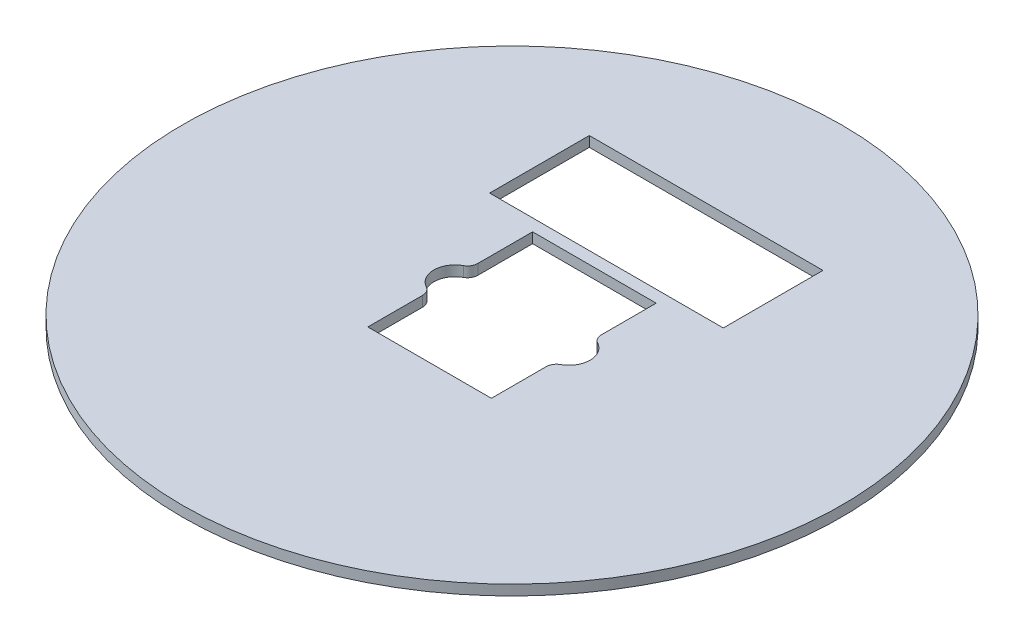
ISO-10303-21;
HEADER;
FILE_DESCRIPTION(('STEP AP214'),'2;1');
FILE_NAME('part.step','',(''),(''),'','','');
FILE_SCHEMA(('AUTOMOTIVE_DESIGN { 1 0 10303 214 1 1 1 1 }'));
ENDSEC;
DATA;
#1=APPLICATION_CONTEXT('core data for automotive mechanical design processes');
#2=APPLICATION_PROTOCOL_DEFINITION('international standard','automotive_design',2000,#1);
#3=PRODUCT_CONTEXT('',#1,'mechanical');
#4=PRODUCT('Part','Part','',(#3));
#5=PRODUCT_RELATED_PRODUCT_CATEGORY('part','',(#4));
#6=PRODUCT_DEFINITION_FORMATION('','',#4);
#7=PRODUCT_DEFINITION_CONTEXT('part definition',#1,'design');
#8=PRODUCT_DEFINITION('design','',#6,#7);
#9=PRODUCT_DEFINITION_SHAPE('','',#8);
#10=(LENGTH_UNIT() NAMED_UNIT(*) SI_UNIT(.MILLI.,.METRE.));
#11=(NAMED_UNIT(*) PLANE_ANGLE_UNIT() SI_UNIT($,.RADIAN.));
#12=(NAMED_UNIT(*) SI_UNIT($,.STERADIAN.) SOLID_ANGLE_UNIT());
#13=UNCERTAINTY_MEASURE_WITH_UNIT(LENGTH_MEASURE(1.E-05),#10,'distance_accuracy_value','');
#14=(GEOMETRIC_REPRESENTATION_CONTEXT(3) GLOBAL_UNCERTAINTY_ASSIGNED_CONTEXT((#13)) GLOBAL_UNIT_ASSIGNED_CONTEXT((#10,
#11,#12)) REPRESENTATION_CONTEXT('',''));
#15=CARTESIAN_POINT('',(0.,0.,0.));
#16=DIRECTION('',(0.,0.,1.));
#17=DIRECTION('',(1.,0.,0.));
#18=AXIS2_PLACEMENT_3D('',#15,#16,#17);
#19=CARTESIAN_POINT('',(0.,6.35,0.));
#20=DIRECTION('',(0.,1.,0.));
#21=DIRECTION('',(0.,0.,1.));
#22=AXIS2_PLACEMENT_3D('',#19,#20,#21);
#23=PLANE('',#22);
#24=DIRECTION('',(0.,0.,-1.));
#25=VECTOR('',#24,1.);
#26=CARTESIAN_POINT('',(72.029944132483,6.35,-58.2447033909338));
#27=LINE('',#26,#25);
#28=CARTESIAN_POINT('',(72.029944132483,6.35,-58.2447033909338));
#29=VERTEX_POINT('',#28);
#30=CARTESIAN_POINT('',(72.029944132483,6.35,-119.711965927598));
#31=VERTEX_POINT('',#30);
#32=EDGE_CURVE('E160',#29,#31,#27,.T.);
#33=ORIENTED_EDGE('',*,*,#32,.F.);
#34=DIRECTION('',(1.,0.,0.));
#35=VECTOR('',#34,1.);
#36=CARTESIAN_POINT('',(-72.029944132483,6.35,-58.2447033909338));
#37=LINE('',#36,#35);
#38=CARTESIAN_POINT('',(-72.029944132483,6.35,-58.2447033909338));
#39=VERTEX_POINT('',#38);
#40=EDGE_CURVE('E181',#39,#29,#37,.T.);
#41=ORIENTED_EDGE('',*,*,#40,.F.);
#42=DIRECTION('',(0.,0.,1.));
#43=VECTOR('',#42,1.);
#44=CARTESIAN_POINT('',(-72.029944132483,6.35,-58.2447033909338));
#45=LINE('',#44,#43);
#46=CARTESIAN_POINT('',(-72.029944132483,6.35,-119.711965927598));
#47=VERTEX_POINT('',#46);
#48=EDGE_CURVE('E185',#47,#39,#45,.T.);
#49=ORIENTED_EDGE('',*,*,#48,.F.);
#50=DIRECTION('',(-1.,0.,0.));
#51=VECTOR('',#50,1.);
#52=CARTESIAN_POINT('',(-72.029944132483,6.35,-119.711965927598));
#53=LINE('',#52,#51);
#54=EDGE_CURVE('E197',#31,#47,#53,.T.);
#55=ORIENTED_EDGE('',*,*,#54,.F.);
#56=EDGE_LOOP('',(#33,#41,#49,#55));
#57=FACE_BOUND('',#56,.T.);
#58=CARTESIAN_POINT('',(0.,6.35,0.));
#59=DIRECTION('',(0.,1.,0.));
#60=DIRECTION('',(0.,0.,1.));
#61=AXIS2_PLACEMENT_3D('',#58,#59,#60);
#62=CIRCLE('',#61,203.2);
#63=CARTESIAN_POINT('',(0.,6.35,203.2));
#64=VERTEX_POINT('',#63);
#65=EDGE_CURVE('E263',#64,#64,#62,.T.);
#66=ORIENTED_EDGE('',*,*,#65,.T.);
#67=EDGE_LOOP('',(#66));
#68=FACE_BOUND('',#67,.T.);
#69=DIRECTION('',(0.,0.,1.));
#70=VECTOR('',#69,1.);
#71=CARTESIAN_POINT('',(-38.1,6.35,0.));
#72=LINE('',#71,#70);
#73=CARTESIAN_POINT('',(-38.1,6.35,17.009335660401));
#74=VERTEX_POINT('',#73);
#75=CARTESIAN_POINT('',(-38.1,6.35,50.8));
#76=VERTEX_POINT('',#75);
#77=EDGE_CURVE('E235',#74,#76,#72,.T.);
#78=ORIENTED_EDGE('',*,*,#77,.F.);
#79=CARTESIAN_POINT('',(-44.45,6.35,17.009335660401));
#80=DIRECTION('',(0.,1.,0.));
#81=DIRECTION('',(0.,0.,1.));
#82=AXIS2_PLACEMENT_3D('',#79,#80,#81);
#83=CIRCLE('',#82,6.35);
#84=CARTESIAN_POINT('',(-41.401340380558,6.35,11.4390417251778));
#85=VERTEX_POINT('',#84);
#86=EDGE_CURVE('E62',#74,#85,#83,.T.);
#87=ORIENTED_EDGE('',*,*,#86,.T.);
#88=CARTESIAN_POINT('',(-35.1406753244214,6.35,0.));
#89=DIRECTION('',(0.,1.,0.));
#90=DIRECTION('',(0.,0.,1.));
#91=AXIS2_PLACEMENT_3D('',#88,#89,#90);
#92=CIRCLE('',#91,13.0402301565382);
#93=CARTESIAN_POINT('',(-41.401340380558,6.35,-11.4390417251778));
#94=VERTEX_POINT('',#93);
#95=EDGE_CURVE('E188',#94,#85,#92,.T.);
#96=ORIENTED_EDGE('',*,*,#95,.F.);
#97=CARTESIAN_POINT('',(-44.45,6.35,-17.0093356604009));
#98=DIRECTION('',(0.,1.,0.));
#99=DIRECTION('',(0.,0.,1.));
#100=AXIS2_PLACEMENT_3D('',#97,#98,#99);
#101=CIRCLE('',#100,6.35);
#102=CARTESIAN_POINT('',(-38.1,6.35,-17.0093356604009));
#103=VERTEX_POINT('',#102);
#104=EDGE_CURVE('E301',#94,#103,#101,.T.);
#105=ORIENTED_EDGE('',*,*,#104,.T.);
#106=CARTESIAN_POINT('',(-38.1,6.35,-50.8));
#107=VERTEX_POINT('',#106);
#108=EDGE_CURVE('E236',#107,#103,#72,.T.);
#109=ORIENTED_EDGE('',*,*,#108,.F.);
#110=DIRECTION('',(-1.,0.,0.));
#111=VECTOR('',#110,1.);
#112=CARTESIAN_POINT('',(0.,6.35,-50.8));
#113=LINE('',#112,#111);
#114=CARTESIAN_POINT('',(38.1,6.35,-50.8));
#115=VERTEX_POINT('',#114);
#116=EDGE_CURVE('E207',#115,#107,#113,.T.);
#117=ORIENTED_EDGE('',*,*,#116,.F.);
#118=DIRECTION('',(0.,0.,1.));
#119=VECTOR('',#118,1.);
#120=CARTESIAN_POINT('',(38.1,6.35,0.));
#121=LINE('',#120,#119);
#122=CARTESIAN_POINT('',(38.1,6.35,-17.009335660401));
#123=VERTEX_POINT('',#122);
#124=EDGE_CURVE('E218',#115,#123,#121,.T.);
#125=ORIENTED_EDGE('',*,*,#124,.T.);
#126=CARTESIAN_POINT('',(44.45,6.35,-17.009335660401));
#127=DIRECTION('',(0.,1.,0.));
#128=DIRECTION('',(0.,0.,1.));
#129=AXIS2_PLACEMENT_3D('',#126,#127,#128);
#130=CIRCLE('',#129,6.35);
#131=CARTESIAN_POINT('',(41.401340380558,6.35,-11.4390417251778));
#132=VERTEX_POINT('',#131);
#133=EDGE_CURVE('E288',#123,#132,#130,.T.);
#134=ORIENTED_EDGE('',*,*,#133,.T.);
#135=CARTESIAN_POINT('',(35.1406753244215,6.35,0.));
#136=DIRECTION('',(0.,1.,0.));
#137=DIRECTION('',(0.,0.,1.));
#138=AXIS2_PLACEMENT_3D('',#135,#136,#137);
#139=CIRCLE('',#138,13.0402301565382);
#140=CARTESIAN_POINT('',(41.401340380558,6.35,11.4390417251778));
#141=VERTEX_POINT('',#140);
#142=EDGE_CURVE('E393',#132,#141,#139,.F.);
#143=ORIENTED_EDGE('',*,*,#142,.T.);
#144=CARTESIAN_POINT('',(44.45,6.35,17.009335660401));
#145=DIRECTION('',(0.,1.,0.));
#146=DIRECTION('',(0.,0.,1.));
#147=AXIS2_PLACEMENT_3D('',#144,#145,#146);
#148=CIRCLE('',#147,6.35);
#149=CARTESIAN_POINT('',(38.1,6.35,17.009335660401));
#150=VERTEX_POINT('',#149);
#151=EDGE_CURVE('E274',#141,#150,#148,.T.);
#152=ORIENTED_EDGE('',*,*,#151,.T.);
#153=CARTESIAN_POINT('',(38.1,6.35,50.8));
#154=VERTEX_POINT('',#153);
#155=EDGE_CURVE('E244',#150,#154,#121,.T.);
#156=ORIENTED_EDGE('',*,*,#155,.T.);
#157=DIRECTION('',(-1.,0.,0.));
#158=VECTOR('',#157,1.);
#159=CARTESIAN_POINT('',(0.,6.35,50.8));
#160=LINE('',#159,#158);
#161=EDGE_CURVE('E240',#154,#76,#160,.T.);
#162=ORIENTED_EDGE('',*,*,#161,.T.);
#163=EDGE_LOOP('',(#78,#87,#96,#105,#109,#117,#125,#134,#143,#152,#156,#162));
#164=FACE_BOUND('',#163,.T.);
#165=ADVANCED_FACE('F39',(#57,#68,#164),#23,.T.);
#166=CARTESIAN_POINT('',(0.,0.,0.));
#167=DIRECTION('',(0.,1.,0.));
#168=DIRECTION('',(0.,0.,1.));
#169=AXIS2_PLACEMENT_3D('',#166,#167,#168);
#170=PLANE('',#169);
#171=CARTESIAN_POINT('',(0.,0.,0.));
#172=DIRECTION('',(0.,1.,0.));
#173=DIRECTION('',(0.,0.,1.));
#174=AXIS2_PLACEMENT_3D('',#171,#172,#173);
#175=CIRCLE('',#174,203.2);
#176=CARTESIAN_POINT('',(0.,0.,203.2));
#177=VERTEX_POINT('',#176);
#178=EDGE_CURVE('E251',#177,#177,#175,.T.);
#179=ORIENTED_EDGE('',*,*,#178,.F.);
#180=EDGE_LOOP('',(#179));
#181=FACE_BOUND('',#180,.T.);
#182=DIRECTION('',(1.,0.,0.));
#183=VECTOR('',#182,1.);
#184=CARTESIAN_POINT('',(-72.029944132483,0.,-58.2447033909338));
#185=LINE('',#184,#183);
#186=CARTESIAN_POINT('',(-72.029944132483,0.,-58.2447033909338));
#187=VERTEX_POINT('',#186);
#188=CARTESIAN_POINT('',(72.029944132483,0.,-58.2447033909338));
#189=VERTEX_POINT('',#188);
#190=EDGE_CURVE('E166',#187,#189,#185,.T.);
#191=ORIENTED_EDGE('',*,*,#190,.T.);
#192=DIRECTION('',(0.,0.,-1.));
#193=VECTOR('',#192,1.);
#194=CARTESIAN_POINT('',(72.029944132483,0.,-58.2447033909338));
#195=LINE('',#194,#193);
#196=CARTESIAN_POINT('',(72.029944132483,0.,-119.711965927598));
#197=VERTEX_POINT('',#196);
#198=EDGE_CURVE('E157',#189,#197,#195,.T.);
#199=ORIENTED_EDGE('',*,*,#198,.T.);
#200=DIRECTION('',(-1.,0.,0.));
#201=VECTOR('',#200,1.);
#202=CARTESIAN_POINT('',(-72.029944132483,0.,-119.711965927598));
#203=LINE('',#202,#201);
#204=CARTESIAN_POINT('',(-72.029944132483,0.,-119.711965927598));
#205=VERTEX_POINT('',#204);
#206=EDGE_CURVE('E170',#197,#205,#203,.T.);
#207=ORIENTED_EDGE('',*,*,#206,.T.);
#208=DIRECTION('',(0.,0.,1.));
#209=VECTOR('',#208,1.);
#210=CARTESIAN_POINT('',(-72.029944132483,0.,-58.2447033909338));
#211=LINE('',#210,#209);
#212=EDGE_CURVE('E175',#205,#187,#211,.T.);
#213=ORIENTED_EDGE('',*,*,#212,.T.);
#214=EDGE_LOOP('',(#191,#199,#207,#213));
#215=FACE_BOUND('',#214,.T.);
#216=CARTESIAN_POINT('',(-35.1406753244214,0.,0.));
#217=DIRECTION('',(0.,1.,0.));
#218=DIRECTION('',(0.,0.,1.));
#219=AXIS2_PLACEMENT_3D('',#216,#217,#218);
#220=CIRCLE('',#219,13.0402301565382);
#221=CARTESIAN_POINT('',(-41.401340380558,0.,-11.4390417251778));
#222=VERTEX_POINT('',#221);
#223=CARTESIAN_POINT('',(-41.401340380558,0.,11.4390417251778));
#224=VERTEX_POINT('',#223);
#225=EDGE_CURVE('E389',#222,#224,#220,.T.);
#226=ORIENTED_EDGE('',*,*,#225,.T.);
#227=CARTESIAN_POINT('',(-44.45,0.,17.009335660401));
#228=DIRECTION('',(0.,1.,0.));
#229=DIRECTION('',(0.,0.,1.));
#230=AXIS2_PLACEMENT_3D('',#227,#228,#229);
#231=CIRCLE('',#230,6.35);
#232=CARTESIAN_POINT('',(-38.1,0.,17.009335660401));
#233=VERTEX_POINT('',#232);
#234=EDGE_CURVE('E11',#224,#233,#231,.F.);
#235=ORIENTED_EDGE('',*,*,#234,.T.);
#236=DIRECTION('',(0.,0.,1.));
#237=VECTOR('',#236,1.);
#238=CARTESIAN_POINT('',(-38.1,0.,0.));
#239=LINE('',#238,#237);
#240=CARTESIAN_POINT('',(-38.1,0.,50.8));
#241=VERTEX_POINT('',#240);
#242=EDGE_CURVE('E217',#233,#241,#239,.T.);
#243=ORIENTED_EDGE('',*,*,#242,.T.);
#244=DIRECTION('',(-1.,0.,0.));
#245=VECTOR('',#244,1.);
#246=CARTESIAN_POINT('',(0.,0.,50.8));
#247=LINE('',#246,#245);
#248=CARTESIAN_POINT('',(38.1,0.,50.8));
#249=VERTEX_POINT('',#248);
#250=EDGE_CURVE('E223',#249,#241,#247,.T.);
#251=ORIENTED_EDGE('',*,*,#250,.F.);
#252=DIRECTION('',(0.,0.,1.));
#253=VECTOR('',#252,1.);
#254=CARTESIAN_POINT('',(38.1,0.,0.));
#255=LINE('',#254,#253);
#256=CARTESIAN_POINT('',(38.1,0.,17.009335660401));
#257=VERTEX_POINT('',#256);
#258=EDGE_CURVE('E227',#257,#249,#255,.T.);
#259=ORIENTED_EDGE('',*,*,#258,.F.);
#260=CARTESIAN_POINT('',(44.45,0.,17.009335660401));
#261=DIRECTION('',(0.,1.,0.));
#262=DIRECTION('',(0.,0.,1.));
#263=AXIS2_PLACEMENT_3D('',#260,#261,#262);
#264=CIRCLE('',#263,6.35);
#265=CARTESIAN_POINT('',(41.401340380558,0.,11.4390417251778));
#266=VERTEX_POINT('',#265);
#267=EDGE_CURVE('E280',#257,#266,#264,.F.);
#268=ORIENTED_EDGE('',*,*,#267,.T.);
#269=CARTESIAN_POINT('',(35.1406753244215,0.,0.));
#270=DIRECTION('',(0.,1.,0.));
#271=DIRECTION('',(0.,0.,1.));
#272=AXIS2_PLACEMENT_3D('',#269,#270,#271);
#273=CIRCLE('',#272,13.0402301565382);
#274=CARTESIAN_POINT('',(41.401340380558,0.,-11.4390417251778));
#275=VERTEX_POINT('',#274);
#276=EDGE_CURVE('E198',#275,#266,#273,.F.);
#277=ORIENTED_EDGE('',*,*,#276,.F.);
#278=CARTESIAN_POINT('',(44.45,0.,-17.009335660401));
#279=DIRECTION('',(0.,1.,0.));
#280=DIRECTION('',(0.,0.,1.));
#281=AXIS2_PLACEMENT_3D('',#278,#279,#280);
#282=CIRCLE('',#281,6.35);
#283=CARTESIAN_POINT('',(38.1,0.,-17.009335660401));
#284=VERTEX_POINT('',#283);
#285=EDGE_CURVE('E294',#275,#284,#282,.F.);
#286=ORIENTED_EDGE('',*,*,#285,.T.);
#287=CARTESIAN_POINT('',(38.1,0.,-50.8));
#288=VERTEX_POINT('',#287);
#289=EDGE_CURVE('E228',#288,#284,#255,.T.);
#290=ORIENTED_EDGE('',*,*,#289,.F.);
#291=DIRECTION('',(-1.,0.,0.));
#292=VECTOR('',#291,1.);
#293=CARTESIAN_POINT('',(0.,0.,-50.8));
#294=LINE('',#293,#292);
#295=CARTESIAN_POINT('',(-38.1,0.,-50.8));
#296=VERTEX_POINT('',#295);
#297=EDGE_CURVE('E213',#288,#296,#294,.T.);
#298=ORIENTED_EDGE('',*,*,#297,.T.);
#299=CARTESIAN_POINT('',(-38.1,0.,-17.0093356604009));
#300=VERTEX_POINT('',#299);
#301=EDGE_CURVE('E219',#296,#300,#239,.T.);
#302=ORIENTED_EDGE('',*,*,#301,.T.);
#303=CARTESIAN_POINT('',(-44.45,0.,-17.0093356604009));
#304=DIRECTION('',(0.,1.,0.));
#305=DIRECTION('',(0.,0.,1.));
#306=AXIS2_PLACEMENT_3D('',#303,#304,#305);
#307=CIRCLE('',#306,6.35);
#308=EDGE_CURVE('E307',#300,#222,#307,.F.);
#309=ORIENTED_EDGE('',*,*,#308,.T.);
#310=EDGE_LOOP('',(#226,#235,#243,#251,#259,#268,#277,#286,#290,#298,#302,#309));
#311=FACE_BOUND('',#310,.T.);
#312=ADVANCED_FACE('F177',(#181,#215,#311),#170,.F.);
#313=CARTESIAN_POINT('',(38.1,0.,0.));
#314=DIRECTION('',(-1.,0.,0.));
#315=DIRECTION('',(0.,0.,1.));
#316=AXIS2_PLACEMENT_3D('',#313,#314,#315);
#317=PLANE('',#316);
#318=ORIENTED_EDGE('',*,*,#155,.F.);
#319=DIRECTION('',(0.,1.,0.));
#320=VECTOR('',#319,1.);
#321=CARTESIAN_POINT('',(38.1,0.,17.009335660401));
#322=LINE('',#321,#320);
#323=EDGE_CURVE('E277',#150,#257,#322,.F.);
#324=ORIENTED_EDGE('',*,*,#323,.T.);
#325=ORIENTED_EDGE('',*,*,#258,.T.);
#326=DIRECTION('',(0.,1.,0.));
#327=VECTOR('',#326,1.);
#328=CARTESIAN_POINT('',(38.1,0.,50.8));
#329=LINE('',#328,#327);
#330=EDGE_CURVE('E252',#249,#154,#329,.T.);
#331=ORIENTED_EDGE('',*,*,#330,.T.);
#332=EDGE_LOOP('',(#318,#324,#325,#331));
#333=FACE_BOUND('',#332,.T.);
#334=ADVANCED_FACE('F334',(#333),#317,.T.);
#335=ORIENTED_EDGE('',*,*,#289,.T.);
#336=DIRECTION('',(0.,1.,0.));
#337=VECTOR('',#336,1.);
#338=CARTESIAN_POINT('',(38.1,0.,-17.009335660401));
#339=LINE('',#338,#337);
#340=EDGE_CURVE('E284',#284,#123,#339,.T.);
#341=ORIENTED_EDGE('',*,*,#340,.T.);
#342=ORIENTED_EDGE('',*,*,#124,.F.);
#343=DIRECTION('',(0.,1.,0.));
#344=VECTOR('',#343,1.);
#345=CARTESIAN_POINT('',(38.1,0.,-50.8));
#346=LINE('',#345,#344);
#347=EDGE_CURVE('E248',#288,#115,#346,.T.);
#348=ORIENTED_EDGE('',*,*,#347,.F.);
#349=EDGE_LOOP('',(#335,#341,#342,#348));
#350=FACE_BOUND('',#349,.T.);
#351=ADVANCED_FACE('F378',(#350),#317,.T.);
#352=CARTESIAN_POINT('',(-38.1,0.,0.));
#353=DIRECTION('',(-1.,0.,0.));
#354=DIRECTION('',(0.,0.,1.));
#355=AXIS2_PLACEMENT_3D('',#352,#353,#354);
#356=PLANE('',#355);
#357=ORIENTED_EDGE('',*,*,#242,.F.);
#358=DIRECTION('',(0.,1.,0.));
#359=VECTOR('',#358,1.);
#360=CARTESIAN_POINT('',(-38.1,0.,17.009335660401));
#361=LINE('',#360,#359);
#362=EDGE_CURVE('E310',#233,#74,#361,.T.);
#363=ORIENTED_EDGE('',*,*,#362,.T.);
#364=ORIENTED_EDGE('',*,*,#77,.T.);
#365=DIRECTION('',(0.,1.,0.));
#366=VECTOR('',#365,1.);
#367=CARTESIAN_POINT('',(-38.1,0.,50.8));
#368=LINE('',#367,#366);
#369=EDGE_CURVE('E256',#241,#76,#368,.T.);
#370=ORIENTED_EDGE('',*,*,#369,.F.);
#371=EDGE_LOOP('',(#357,#363,#364,#370));
#372=FACE_BOUND('',#371,.T.);
#373=ADVANCED_FACE('F323',(#372),#356,.F.);
#374=CARTESIAN_POINT('',(0.,6.35,0.));
#375=DIRECTION('',(0.,-1.,0.));
#376=DIRECTION('',(0.,0.,-1.));
#377=AXIS2_PLACEMENT_3D('',#374,#375,#376);
#378=CYLINDRICAL_SURFACE('',#377,203.2);
#379=ORIENTED_EDGE('',*,*,#65,.F.);
#380=EDGE_LOOP('',(#379));
#381=FACE_BOUND('',#380,.T.);
#382=ORIENTED_EDGE('',*,*,#178,.T.);
#383=EDGE_LOOP('',(#382));
#384=FACE_BOUND('',#383,.T.);
#385=ADVANCED_FACE('F359',(#381,#384),#378,.T.);
#386=CARTESIAN_POINT('',(0.,0.,-50.8));
#387=DIRECTION('',(0.,0.,-1.));
#388=DIRECTION('',(-1.,0.,0.));
#389=AXIS2_PLACEMENT_3D('',#386,#387,#388);
#390=PLANE('',#389);
#391=ORIENTED_EDGE('',*,*,#116,.T.);
#392=DIRECTION('',(0.,1.,0.));
#393=VECTOR('',#392,1.);
#394=CARTESIAN_POINT('',(-38.1,0.,-50.8));
#395=LINE('',#394,#393);
#396=EDGE_CURVE('E232',#296,#107,#395,.T.);
#397=ORIENTED_EDGE('',*,*,#396,.F.);
#398=ORIENTED_EDGE('',*,*,#297,.F.);
#399=ORIENTED_EDGE('',*,*,#347,.T.);
#400=EDGE_LOOP('',(#391,#397,#398,#399));
#401=FACE_BOUND('',#400,.T.);
#402=ADVANCED_FACE('F356',(#401),#390,.F.);
#403=CARTESIAN_POINT('',(0.,0.,50.8));
#404=DIRECTION('',(0.,0.,-1.));
#405=DIRECTION('',(-1.,0.,0.));
#406=AXIS2_PLACEMENT_3D('',#403,#404,#405);
#407=PLANE('',#406);
#408=ORIENTED_EDGE('',*,*,#161,.F.);
#409=ORIENTED_EDGE('',*,*,#330,.F.);
#410=ORIENTED_EDGE('',*,*,#250,.T.);
#411=ORIENTED_EDGE('',*,*,#369,.T.);
#412=EDGE_LOOP('',(#408,#409,#410,#411));
#413=FACE_BOUND('',#412,.T.);
#414=ADVANCED_FACE('F327',(#413),#407,.T.);
#415=ORIENTED_EDGE('',*,*,#108,.T.);
#416=DIRECTION('',(0.,1.,0.));
#417=VECTOR('',#416,1.);
#418=CARTESIAN_POINT('',(-38.1,0.,-17.0093356604009));
#419=LINE('',#418,#417);
#420=EDGE_CURVE('E304',#103,#300,#419,.F.);
#421=ORIENTED_EDGE('',*,*,#420,.T.);
#422=ORIENTED_EDGE('',*,*,#301,.F.);
#423=ORIENTED_EDGE('',*,*,#396,.T.);
#424=EDGE_LOOP('',(#415,#421,#422,#423));
#425=FACE_BOUND('',#424,.T.);
#426=ADVANCED_FACE('F401',(#425),#356,.F.);
#427=CARTESIAN_POINT('',(72.029944132483,0.,-58.2447033909338));
#428=DIRECTION('',(1.,0.,0.));
#429=DIRECTION('',(0.,0.,-1.));
#430=AXIS2_PLACEMENT_3D('',#427,#428,#429);
#431=PLANE('',#430);
#432=ORIENTED_EDGE('',*,*,#32,.T.);
#433=DIRECTION('',(0.,1.,0.));
#434=VECTOR('',#433,1.);
#435=CARTESIAN_POINT('',(72.029944132483,0.,-119.711965927598));
#436=LINE('',#435,#434);
#437=EDGE_CURVE('E153',#197,#31,#436,.T.);
#438=ORIENTED_EDGE('',*,*,#437,.F.);
#439=ORIENTED_EDGE('',*,*,#198,.F.);
#440=DIRECTION('',(0.,1.,0.));
#441=VECTOR('',#440,1.);
#442=CARTESIAN_POINT('',(72.029944132483,0.,-58.2447033909338));
#443=LINE('',#442,#441);
#444=EDGE_CURVE('E204',#189,#29,#443,.T.);
#445=ORIENTED_EDGE('',*,*,#444,.T.);
#446=EDGE_LOOP('',(#432,#438,#439,#445));
#447=FACE_BOUND('',#446,.T.);
#448=ADVANCED_FACE('F155',(#447),#431,.F.);
#449=CARTESIAN_POINT('',(-72.029944132483,0.,-58.2447033909338));
#450=DIRECTION('',(0.,0.,1.));
#451=DIRECTION('',(1.,0.,0.));
#452=AXIS2_PLACEMENT_3D('',#449,#450,#451);
#453=PLANE('',#452);
#454=ORIENTED_EDGE('',*,*,#40,.T.);
#455=ORIENTED_EDGE('',*,*,#444,.F.);
#456=ORIENTED_EDGE('',*,*,#190,.F.);
#457=DIRECTION('',(0.,1.,0.));
#458=VECTOR('',#457,1.);
#459=CARTESIAN_POINT('',(-72.029944132483,0.,-58.2447033909338));
#460=LINE('',#459,#458);
#461=EDGE_CURVE('E208',#187,#39,#460,.T.);
#462=ORIENTED_EDGE('',*,*,#461,.T.);
#463=EDGE_LOOP('',(#454,#455,#456,#462));
#464=FACE_BOUND('',#463,.T.);
#465=ADVANCED_FACE('F407',(#464),#453,.F.);
#466=CARTESIAN_POINT('',(-72.029944132483,0.,-58.2447033909338));
#467=DIRECTION('',(-1.,0.,0.));
#468=DIRECTION('',(0.,0.,1.));
#469=AXIS2_PLACEMENT_3D('',#466,#467,#468);
#470=PLANE('',#469);
#471=ORIENTED_EDGE('',*,*,#48,.T.);
#472=ORIENTED_EDGE('',*,*,#461,.F.);
#473=ORIENTED_EDGE('',*,*,#212,.F.);
#474=DIRECTION('',(0.,1.,0.));
#475=VECTOR('',#474,1.);
#476=CARTESIAN_POINT('',(-72.029944132483,0.,-119.711965927598));
#477=LINE('',#476,#475);
#478=EDGE_CURVE('E165',#205,#47,#477,.T.);
#479=ORIENTED_EDGE('',*,*,#478,.T.);
#480=EDGE_LOOP('',(#471,#472,#473,#479));
#481=FACE_BOUND('',#480,.T.);
#482=ADVANCED_FACE('F421',(#481),#470,.F.);
#483=CARTESIAN_POINT('',(-72.029944132483,0.,-119.711965927598));
#484=DIRECTION('',(0.,0.,-1.));
#485=DIRECTION('',(-1.,0.,0.));
#486=AXIS2_PLACEMENT_3D('',#483,#484,#485);
#487=PLANE('',#486);
#488=ORIENTED_EDGE('',*,*,#54,.T.);
#489=ORIENTED_EDGE('',*,*,#478,.F.);
#490=ORIENTED_EDGE('',*,*,#206,.F.);
#491=ORIENTED_EDGE('',*,*,#437,.T.);
#492=EDGE_LOOP('',(#488,#489,#490,#491));
#493=FACE_BOUND('',#492,.T.);
#494=ADVANCED_FACE('F171',(#493),#487,.F.);
#495=CARTESIAN_POINT('',(-35.1406753244214,0.,0.));
#496=DIRECTION('',(0.,1.,0.));
#497=DIRECTION('',(0.,0.,1.));
#498=AXIS2_PLACEMENT_3D('',#495,#496,#497);
#499=CYLINDRICAL_SURFACE('',#498,13.0402301565382);
#500=ORIENTED_EDGE('',*,*,#95,.T.);
#501=DIRECTION('',(0.,1.,0.));
#502=VECTOR('',#501,1.);
#503=CARTESIAN_POINT('',(-41.401340380558,0.,11.4390417251778));
#504=LINE('',#503,#502);
#505=EDGE_CURVE('E48',#85,#224,#504,.F.);
#506=ORIENTED_EDGE('',*,*,#505,.T.);
#507=ORIENTED_EDGE('',*,*,#225,.F.);
#508=DIRECTION('',(0.,1.,0.));
#509=VECTOR('',#508,1.);
#510=CARTESIAN_POINT('',(-41.401340380558,0.,-11.4390417251778));
#511=LINE('',#510,#509);
#512=EDGE_CURVE('E297',#222,#94,#511,.T.);
#513=ORIENTED_EDGE('',*,*,#512,.T.);
#514=EDGE_LOOP('',(#500,#506,#507,#513));
#515=FACE_BOUND('',#514,.T.);
#516=ADVANCED_FACE('F388',(#515),#499,.F.);
#517=CARTESIAN_POINT('',(35.1406753244215,0.,0.));
#518=DIRECTION('',(0.,1.,0.));
#519=DIRECTION('',(0.,0.,1.));
#520=AXIS2_PLACEMENT_3D('',#517,#518,#519);
#521=CYLINDRICAL_SURFACE('',#520,13.0402301565382);
#522=ORIENTED_EDGE('',*,*,#142,.F.);
#523=DIRECTION('',(0.,1.,0.));
#524=VECTOR('',#523,1.);
#525=CARTESIAN_POINT('',(41.401340380558,0.,-11.4390417251778));
#526=LINE('',#525,#524);
#527=EDGE_CURVE('E291',#132,#275,#526,.F.);
#528=ORIENTED_EDGE('',*,*,#527,.T.);
#529=ORIENTED_EDGE('',*,*,#276,.T.);
#530=DIRECTION('',(0.,1.,0.));
#531=VECTOR('',#530,1.);
#532=CARTESIAN_POINT('',(41.401340380558,0.,11.4390417251778));
#533=LINE('',#532,#531);
#534=EDGE_CURVE('E267',#266,#141,#533,.T.);
#535=ORIENTED_EDGE('',*,*,#534,.T.);
#536=EDGE_LOOP('',(#522,#528,#529,#535));
#537=FACE_BOUND('',#536,.T.);
#538=ADVANCED_FACE('F366',(#537),#521,.F.);
#539=CARTESIAN_POINT('',(44.45,0.,17.009335660401));
#540=DIRECTION('',(0.,1.,0.));
#541=DIRECTION('',(0.,0.,1.));
#542=AXIS2_PLACEMENT_3D('',#539,#540,#541);
#543=CYLINDRICAL_SURFACE('',#542,6.35);
#544=ORIENTED_EDGE('',*,*,#267,.F.);
#545=ORIENTED_EDGE('',*,*,#323,.F.);
#546=ORIENTED_EDGE('',*,*,#151,.F.);
#547=ORIENTED_EDGE('',*,*,#534,.F.);
#548=EDGE_LOOP('',(#544,#545,#546,#547));
#549=FACE_BOUND('',#548,.T.);
#550=ADVANCED_FACE('F363',(#549),#543,.T.);
#551=CARTESIAN_POINT('',(44.45,0.,-17.009335660401));
#552=DIRECTION('',(0.,1.,0.));
#553=DIRECTION('',(0.,0.,1.));
#554=AXIS2_PLACEMENT_3D('',#551,#552,#553);
#555=CYLINDRICAL_SURFACE('',#554,6.35);
#556=ORIENTED_EDGE('',*,*,#285,.F.);
#557=ORIENTED_EDGE('',*,*,#527,.F.);
#558=ORIENTED_EDGE('',*,*,#133,.F.);
#559=ORIENTED_EDGE('',*,*,#340,.F.);
#560=EDGE_LOOP('',(#556,#557,#558,#559));
#561=FACE_BOUND('',#560,.T.);
#562=ADVANCED_FACE('F344',(#561),#555,.T.);
#563=CARTESIAN_POINT('',(-44.45,0.,-17.0093356604009));
#564=DIRECTION('',(0.,1.,0.));
#565=DIRECTION('',(0.,0.,1.));
#566=AXIS2_PLACEMENT_3D('',#563,#564,#565);
#567=CYLINDRICAL_SURFACE('',#566,6.35);
#568=ORIENTED_EDGE('',*,*,#308,.F.);
#569=ORIENTED_EDGE('',*,*,#420,.F.);
#570=ORIENTED_EDGE('',*,*,#104,.F.);
#571=ORIENTED_EDGE('',*,*,#512,.F.);
#572=EDGE_LOOP('',(#568,#569,#570,#571));
#573=FACE_BOUND('',#572,.T.);
#574=ADVANCED_FACE('F340',(#573),#567,.T.);
#575=CARTESIAN_POINT('',(-44.45,0.,17.009335660401));
#576=DIRECTION('',(0.,1.,0.));
#577=DIRECTION('',(0.,0.,1.));
#578=AXIS2_PLACEMENT_3D('',#575,#576,#577);
#579=CYLINDRICAL_SURFACE('',#578,6.35);
#580=ORIENTED_EDGE('',*,*,#234,.F.);
#581=ORIENTED_EDGE('',*,*,#505,.F.);
#582=ORIENTED_EDGE('',*,*,#86,.F.);
#583=ORIENTED_EDGE('',*,*,#362,.F.);
#584=EDGE_LOOP('',(#580,#581,#582,#583));
#585=FACE_BOUND('',#584,.T.);
#586=ADVANCED_FACE('F41',(#585),#579,.T.);
#587=CLOSED_SHELL('',(#165,#312,#334,#351,#373,#385,#402,#414,#426,#448,#465,#482,#494,#516,
#538,#550,#562,#574,#586));
#588=MANIFOLD_SOLID_BREP('B2',#587);
#589=ADVANCED_BREP_SHAPE_REPRESENTATION('',(#18,#588),#14);
#590=SHAPE_DEFINITION_REPRESENTATION(#9,#589);
ENDSEC;
END-ISO-10303-21;
